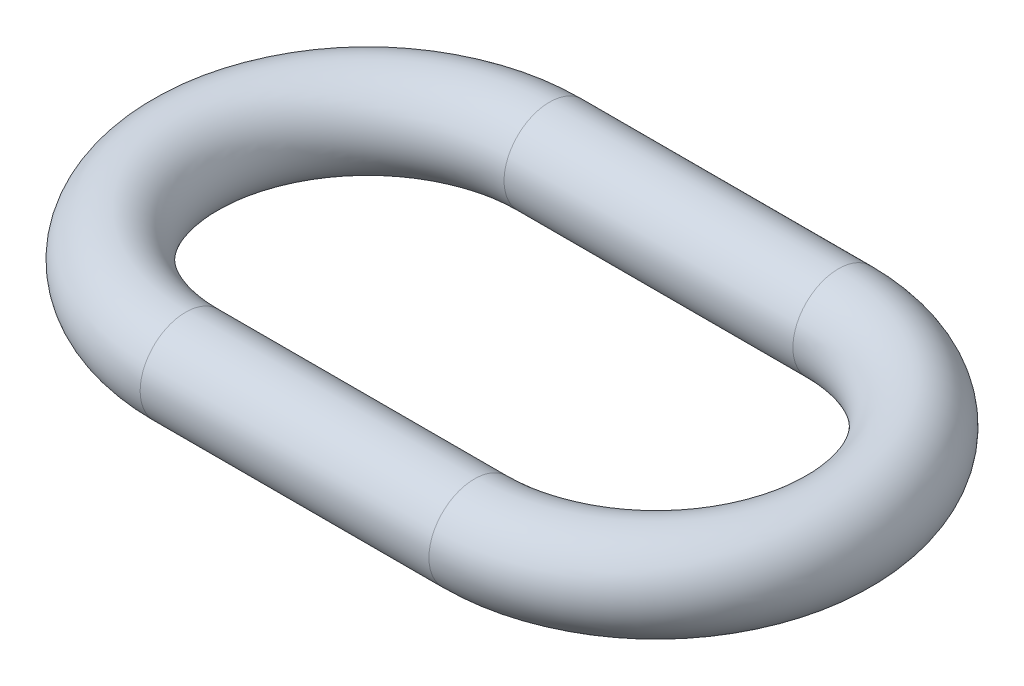
ISO-10303-21;
HEADER;
FILE_DESCRIPTION(('STEP AP214'),'2;1');
FILE_NAME('part.step','',(''),(''),'','','');
FILE_SCHEMA(('AUTOMOTIVE_DESIGN { 1 0 10303 214 1 1 1 1 }'));
ENDSEC;
DATA;
#1=APPLICATION_CONTEXT('core data for automotive mechanical design processes');
#2=APPLICATION_PROTOCOL_DEFINITION('international standard','automotive_design',2000,#1);
#3=PRODUCT_CONTEXT('',#1,'mechanical');
#4=PRODUCT('Part','Part','',(#3));
#5=PRODUCT_RELATED_PRODUCT_CATEGORY('part','',(#4));
#6=PRODUCT_DEFINITION_FORMATION('','',#4);
#7=PRODUCT_DEFINITION_CONTEXT('part definition',#1,'design');
#8=PRODUCT_DEFINITION('design','',#6,#7);
#9=PRODUCT_DEFINITION_SHAPE('','',#8);
#10=(LENGTH_UNIT() NAMED_UNIT(*) SI_UNIT(.MILLI.,.METRE.));
#11=(NAMED_UNIT(*) PLANE_ANGLE_UNIT() SI_UNIT($,.RADIAN.));
#12=(NAMED_UNIT(*) SI_UNIT($,.STERADIAN.) SOLID_ANGLE_UNIT());
#13=UNCERTAINTY_MEASURE_WITH_UNIT(LENGTH_MEASURE(1.E-05),#10,'distance_accuracy_value','');
#14=(GEOMETRIC_REPRESENTATION_CONTEXT(3) GLOBAL_UNCERTAINTY_ASSIGNED_CONTEXT((#13)) GLOBAL_UNIT_ASSIGNED_CONTEXT((#10,
#11,#12)) REPRESENTATION_CONTEXT('',''));
#15=CARTESIAN_POINT('',(0.,0.,0.));
#16=DIRECTION('',(0.,0.,1.));
#17=DIRECTION('',(1.,0.,0.));
#18=AXIS2_PLACEMENT_3D('',#15,#16,#17);
#19=CARTESIAN_POINT('',(4.03120964780122,0.,0.));
#20=DIRECTION('',(0.,-1.,0.));
#21=DIRECTION('',(0.,0.,-1.));
#22=AXIS2_PLACEMENT_3D('',#19,#20,#21);
#23=TOROIDAL_SURFACE('',#22,5.08,1.27);
#24=CARTESIAN_POINT('',(4.03120964780122,0.,-5.08));
#25=DIRECTION('',(-1.,0.,0.));
#26=DIRECTION('',(0.,0.,1.));
#27=AXIS2_PLACEMENT_3D('',#24,#25,#26);
#28=CIRCLE('',#27,1.27);
#29=CARTESIAN_POINT('',(4.03120964780122,0.,-6.35));
#30=VERTEX_POINT('',#29);
#31=EDGE_CURVE('E67',#30,#30,#28,.T.);
#32=CARTESIAN_POINT('',(4.03120964780122,0.,5.08));
#33=DIRECTION('',(1.,0.,0.));
#34=DIRECTION('',(0.,0.,-1.));
#35=AXIS2_PLACEMENT_3D('',#32,#33,#34);
#36=CIRCLE('',#35,1.27);
#37=CARTESIAN_POINT('',(4.03120964780122,0.,6.35));
#38=VERTEX_POINT('',#37);
#39=EDGE_CURVE('E63',#38,#38,#36,.T.);
#40=CARTESIAN_POINT('',(4.03120964780122,0.,0.));
#41=DIRECTION('',(0.,-1.,0.));
#42=DIRECTION('',(0.,0.,-1.));
#43=AXIS2_PLACEMENT_3D('',#40,#41,#42);
#44=CIRCLE('',#43,6.35);
#45=EDGE_CURVE('',#30,#38,#44,.T.);
#46=ORIENTED_EDGE('',*,*,#31,.F.);
#47=ORIENTED_EDGE('',*,*,#39,.T.);
#48=ORIENTED_EDGE('',*,*,#45,.T.);
#49=ORIENTED_EDGE('',*,*,#45,.F.);
#50=EDGE_LOOP('',(#46,#48,#47,#49));
#51=FACE_BOUND('',#50,.T.);
#52=ADVANCED_FACE('F52',(#51),#23,.T.);
#53=CARTESIAN_POINT('',(4.03120964780122,0.,5.08));
#54=DIRECTION('',(-1.,0.,0.));
#55=DIRECTION('',(0.,0.,1.));
#56=AXIS2_PLACEMENT_3D('',#53,#54,#55);
#57=CYLINDRICAL_SURFACE('',#56,1.27);
#58=CARTESIAN_POINT('',(-4.03120964780122,0.,5.08));
#59=DIRECTION('',(1.,0.,0.));
#60=DIRECTION('',(0.,0.,-1.));
#61=AXIS2_PLACEMENT_3D('',#58,#59,#60);
#62=CIRCLE('',#61,1.27);
#63=CARTESIAN_POINT('',(-4.03120964780122,0.,6.35));
#64=VERTEX_POINT('',#63);
#65=EDGE_CURVE('E59',#64,#64,#62,.T.);
#66=ORIENTED_EDGE('',*,*,#65,.T.);
#67=EDGE_LOOP('',(#66));
#68=FACE_BOUND('',#67,.T.);
#69=ORIENTED_EDGE('',*,*,#39,.F.);
#70=EDGE_LOOP('',(#69));
#71=FACE_BOUND('',#70,.T.);
#72=ADVANCED_FACE('F76',(#68,#71),#57,.T.);
#73=CARTESIAN_POINT('',(-4.03120964780122,0.,0.));
#74=DIRECTION('',(0.,-1.,0.));
#75=DIRECTION('',(0.,0.,-1.));
#76=AXIS2_PLACEMENT_3D('',#73,#74,#75);
#77=TOROIDAL_SURFACE('',#76,5.08,1.27);
#78=CARTESIAN_POINT('',(-4.03120964780122,0.,-5.08));
#79=DIRECTION('',(-1.,0.,0.));
#80=DIRECTION('',(0.,0.,1.));
#81=AXIS2_PLACEMENT_3D('',#78,#79,#80);
#82=CIRCLE('',#81,1.27);
#83=CARTESIAN_POINT('',(-4.03120964780122,0.,-6.35000000000001));
#84=VERTEX_POINT('',#83);
#85=EDGE_CURVE('E13',#84,#84,#82,.T.);
#86=CARTESIAN_POINT('',(-4.03120964780122,0.,0.));
#87=DIRECTION('',(0.,-1.,0.));
#88=DIRECTION('',(0.,0.,-1.));
#89=AXIS2_PLACEMENT_3D('',#86,#87,#88);
#90=CIRCLE('',#89,6.35);
#91=EDGE_CURVE('',#64,#84,#90,.T.);
#92=ORIENTED_EDGE('',*,*,#65,.F.);
#93=ORIENTED_EDGE('',*,*,#85,.T.);
#94=ORIENTED_EDGE('',*,*,#91,.T.);
#95=ORIENTED_EDGE('',*,*,#91,.F.);
#96=EDGE_LOOP('',(#92,#94,#93,#95));
#97=FACE_BOUND('',#96,.T.);
#98=ADVANCED_FACE('F82',(#97),#77,.T.);
#99=CARTESIAN_POINT('',(-4.03120964780122,0.,-5.07999999999999));
#100=DIRECTION('',(1.,0.,0.));
#101=DIRECTION('',(0.,0.,-1.));
#102=AXIS2_PLACEMENT_3D('',#99,#100,#101);
#103=CYLINDRICAL_SURFACE('',#102,1.27);
#104=ORIENTED_EDGE('',*,*,#31,.T.);
#105=EDGE_LOOP('',(#104));
#106=FACE_BOUND('',#105,.T.);
#107=ORIENTED_EDGE('',*,*,#85,.F.);
#108=EDGE_LOOP('',(#107));
#109=FACE_BOUND('',#108,.T.);
#110=ADVANCED_FACE('F54',(#106,#109),#103,.T.);
#111=CLOSED_SHELL('',(#52,#72,#98,#110));
#112=MANIFOLD_SOLID_BREP('B2',#111);
#113=ADVANCED_BREP_SHAPE_REPRESENTATION('',(#18,#112),#14);
#114=SHAPE_DEFINITION_REPRESENTATION(#9,#113);
ENDSEC;
END-ISO-10303-21;
